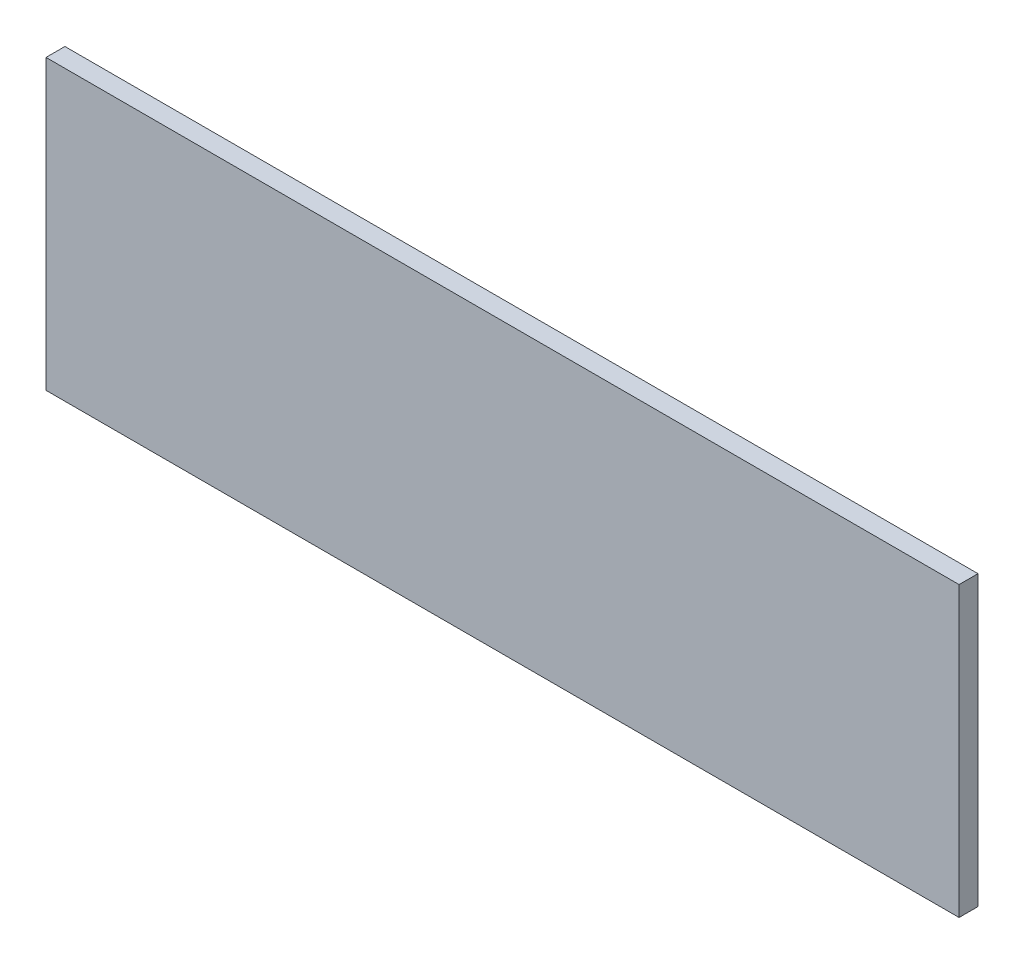
ISO-10303-21;
HEADER;
FILE_DESCRIPTION(('STEP AP214'),'2;1');
FILE_NAME('part.step','',(''),(''),'','','');
FILE_SCHEMA(('AUTOMOTIVE_DESIGN { 1 0 10303 214 1 1 1 1 }'));
ENDSEC;
DATA;
#1=APPLICATION_CONTEXT('core data for automotive mechanical design processes');
#2=APPLICATION_PROTOCOL_DEFINITION('international standard','automotive_design',2000,#1);
#3=PRODUCT_CONTEXT('',#1,'mechanical');
#4=PRODUCT('Part','Part','',(#3));
#5=PRODUCT_RELATED_PRODUCT_CATEGORY('part','',(#4));
#6=PRODUCT_DEFINITION_FORMATION('','',#4);
#7=PRODUCT_DEFINITION_CONTEXT('part definition',#1,'design');
#8=PRODUCT_DEFINITION('design','',#6,#7);
#9=PRODUCT_DEFINITION_SHAPE('','',#8);
#10=(LENGTH_UNIT() NAMED_UNIT(*) SI_UNIT(.MILLI.,.METRE.));
#11=(NAMED_UNIT(*) PLANE_ANGLE_UNIT() SI_UNIT($,.RADIAN.));
#12=(NAMED_UNIT(*) SI_UNIT($,.STERADIAN.) SOLID_ANGLE_UNIT());
#13=UNCERTAINTY_MEASURE_WITH_UNIT(LENGTH_MEASURE(1.E-05),#10,'distance_accuracy_value','');
#14=(GEOMETRIC_REPRESENTATION_CONTEXT(3) GLOBAL_UNCERTAINTY_ASSIGNED_CONTEXT((#13)) GLOBAL_UNIT_ASSIGNED_CONTEXT((#10,
#11,#12)) REPRESENTATION_CONTEXT('',''));
#15=CARTESIAN_POINT('',(0.,0.,0.));
#16=DIRECTION('',(0.,0.,1.));
#17=DIRECTION('',(1.,0.,0.));
#18=AXIS2_PLACEMENT_3D('',#15,#16,#17);
#19=CARTESIAN_POINT('',(-24.13,7.62,0.5));
#20=DIRECTION('',(1.,0.,0.));
#21=DIRECTION('',(0.,0.,-1.));
#22=AXIS2_PLACEMENT_3D('',#19,#20,#21);
#23=PLANE('',#22);
#24=DIRECTION('',(0.,-1.,0.));
#25=VECTOR('',#24,1.);
#26=CARTESIAN_POINT('',(-24.13,7.62,-0.5));
#27=LINE('',#26,#25);
#28=CARTESIAN_POINT('',(-24.13,7.62,-0.5));
#29=VERTEX_POINT('',#28);
#30=CARTESIAN_POINT('',(-24.13,-7.62,-0.5));
#31=VERTEX_POINT('',#30);
#32=EDGE_CURVE('E96',#29,#31,#27,.T.);
#33=ORIENTED_EDGE('',*,*,#32,.T.);
#34=DIRECTION('',(0.,0.,-1.));
#35=VECTOR('',#34,1.);
#36=CARTESIAN_POINT('',(-24.13,-7.62,0.5));
#37=LINE('',#36,#35);
#38=CARTESIAN_POINT('',(-24.13,-7.62,0.5));
#39=VERTEX_POINT('',#38);
#40=EDGE_CURVE('E11',#39,#31,#37,.T.);
#41=ORIENTED_EDGE('',*,*,#40,.F.);
#42=DIRECTION('',(0.,-1.,0.));
#43=VECTOR('',#42,1.);
#44=CARTESIAN_POINT('',(-24.13,7.62,0.5));
#45=LINE('',#44,#43);
#46=CARTESIAN_POINT('',(-24.13,7.62,0.5));
#47=VERTEX_POINT('',#46);
#48=EDGE_CURVE('E84',#47,#39,#45,.T.);
#49=ORIENTED_EDGE('',*,*,#48,.F.);
#50=DIRECTION('',(0.,0.,-1.));
#51=VECTOR('',#50,1.);
#52=CARTESIAN_POINT('',(-24.13,7.62,0.5));
#53=LINE('',#52,#51);
#54=EDGE_CURVE('E92',#47,#29,#53,.T.);
#55=ORIENTED_EDGE('',*,*,#54,.T.);
#56=EDGE_LOOP('',(#33,#41,#49,#55));
#57=FACE_BOUND('',#56,.T.);
#58=ADVANCED_FACE('F33',(#57),#23,.F.);
#59=CARTESIAN_POINT('',(-24.13,-7.62,0.5));
#60=DIRECTION('',(0.,1.,0.));
#61=DIRECTION('',(0.,0.,1.));
#62=AXIS2_PLACEMENT_3D('',#59,#60,#61);
#63=PLANE('',#62);
#64=DIRECTION('',(1.,0.,0.));
#65=VECTOR('',#64,1.);
#66=CARTESIAN_POINT('',(-24.13,-7.62,-0.5));
#67=LINE('',#66,#65);
#68=CARTESIAN_POINT('',(24.13,-7.62,-0.5));
#69=VERTEX_POINT('',#68);
#70=EDGE_CURVE('E88',#31,#69,#67,.T.);
#71=ORIENTED_EDGE('',*,*,#70,.T.);
#72=DIRECTION('',(0.,0.,-1.));
#73=VECTOR('',#72,1.);
#74=CARTESIAN_POINT('',(24.13,-7.62,0.5));
#75=LINE('',#74,#73);
#76=CARTESIAN_POINT('',(24.13,-7.62,0.5));
#77=VERTEX_POINT('',#76);
#78=EDGE_CURVE('E41',#77,#69,#75,.T.);
#79=ORIENTED_EDGE('',*,*,#78,.F.);
#80=DIRECTION('',(1.,0.,0.));
#81=VECTOR('',#80,1.);
#82=CARTESIAN_POINT('',(-24.13,-7.62,0.5));
#83=LINE('',#82,#81);
#84=EDGE_CURVE('E79',#39,#77,#83,.T.);
#85=ORIENTED_EDGE('',*,*,#84,.F.);
#86=ORIENTED_EDGE('',*,*,#40,.T.);
#87=EDGE_LOOP('',(#71,#79,#85,#86));
#88=FACE_BOUND('',#87,.T.);
#89=ADVANCED_FACE('F87',(#88),#63,.F.);
#90=CARTESIAN_POINT('',(24.13,7.62,0.5));
#91=DIRECTION('',(-1.,0.,0.));
#92=DIRECTION('',(0.,0.,1.));
#93=AXIS2_PLACEMENT_3D('',#90,#91,#92);
#94=PLANE('',#93);
#95=DIRECTION('',(0.,1.,0.));
#96=VECTOR('',#95,1.);
#97=CARTESIAN_POINT('',(24.13,7.62,-0.5));
#98=LINE('',#97,#96);
#99=CARTESIAN_POINT('',(24.13,7.62,-0.5));
#100=VERTEX_POINT('',#99);
#101=EDGE_CURVE('E66',#69,#100,#98,.T.);
#102=ORIENTED_EDGE('',*,*,#101,.T.);
#103=DIRECTION('',(0.,0.,-1.));
#104=VECTOR('',#103,1.);
#105=CARTESIAN_POINT('',(24.13,7.62,0.5));
#106=LINE('',#105,#104);
#107=CARTESIAN_POINT('',(24.13,7.62,0.5));
#108=VERTEX_POINT('',#107);
#109=EDGE_CURVE('E89',#108,#100,#106,.T.);
#110=ORIENTED_EDGE('',*,*,#109,.F.);
#111=DIRECTION('',(0.,1.,0.));
#112=VECTOR('',#111,1.);
#113=CARTESIAN_POINT('',(24.13,7.62,0.5));
#114=LINE('',#113,#112);
#115=EDGE_CURVE('E82',#77,#108,#114,.T.);
#116=ORIENTED_EDGE('',*,*,#115,.F.);
#117=ORIENTED_EDGE('',*,*,#78,.T.);
#118=EDGE_LOOP('',(#102,#110,#116,#117));
#119=FACE_BOUND('',#118,.T.);
#120=ADVANCED_FACE('F90',(#119),#94,.F.);
#121=CARTESIAN_POINT('',(-24.13,7.62,0.5));
#122=DIRECTION('',(0.,-1.,0.));
#123=DIRECTION('',(0.,0.,-1.));
#124=AXIS2_PLACEMENT_3D('',#121,#122,#123);
#125=PLANE('',#124);
#126=DIRECTION('',(-1.,0.,0.));
#127=VECTOR('',#126,1.);
#128=CARTESIAN_POINT('',(-24.13,7.62,-0.5));
#129=LINE('',#128,#127);
#130=EDGE_CURVE('E72',#100,#29,#129,.T.);
#131=ORIENTED_EDGE('',*,*,#130,.T.);
#132=ORIENTED_EDGE('',*,*,#54,.F.);
#133=DIRECTION('',(-1.,0.,0.));
#134=VECTOR('',#133,1.);
#135=CARTESIAN_POINT('',(-24.13,7.62,0.5));
#136=LINE('',#135,#134);
#137=EDGE_CURVE('E49',#108,#47,#136,.T.);
#138=ORIENTED_EDGE('',*,*,#137,.F.);
#139=ORIENTED_EDGE('',*,*,#109,.T.);
#140=EDGE_LOOP('',(#131,#132,#138,#139));
#141=FACE_BOUND('',#140,.T.);
#142=ADVANCED_FACE('F103',(#141),#125,.F.);
#143=CARTESIAN_POINT('',(0.,0.,0.5));
#144=DIRECTION('',(0.,0.,1.));
#145=DIRECTION('',(1.,0.,0.));
#146=AXIS2_PLACEMENT_3D('',#143,#144,#145);
#147=PLANE('',#146);
#148=ORIENTED_EDGE('',*,*,#48,.T.);
#149=ORIENTED_EDGE('',*,*,#84,.T.);
#150=ORIENTED_EDGE('',*,*,#115,.T.);
#151=ORIENTED_EDGE('',*,*,#137,.T.);
#152=EDGE_LOOP('',(#148,#149,#150,#151));
#153=FACE_BOUND('',#152,.T.);
#154=ADVANCED_FACE('F80',(#153),#147,.T.);
#155=CARTESIAN_POINT('',(0.,0.,-0.5));
#156=DIRECTION('',(0.,0.,1.));
#157=DIRECTION('',(1.,0.,0.));
#158=AXIS2_PLACEMENT_3D('',#155,#156,#157);
#159=PLANE('',#158);
#160=ORIENTED_EDGE('',*,*,#32,.F.);
#161=ORIENTED_EDGE('',*,*,#130,.F.);
#162=ORIENTED_EDGE('',*,*,#101,.F.);
#163=ORIENTED_EDGE('',*,*,#70,.F.);
#164=EDGE_LOOP('',(#160,#161,#162,#163));
#165=FACE_BOUND('',#164,.T.);
#166=ADVANCED_FACE('F106',(#165),#159,.F.);
#167=CLOSED_SHELL('',(#58,#89,#120,#142,#154,#166));
#168=MANIFOLD_SOLID_BREP('B2',#167);
#169=ADVANCED_BREP_SHAPE_REPRESENTATION('',(#18,#168),#14);
#170=SHAPE_DEFINITION_REPRESENTATION(#9,#169);
ENDSEC;
END-ISO-10303-21;
